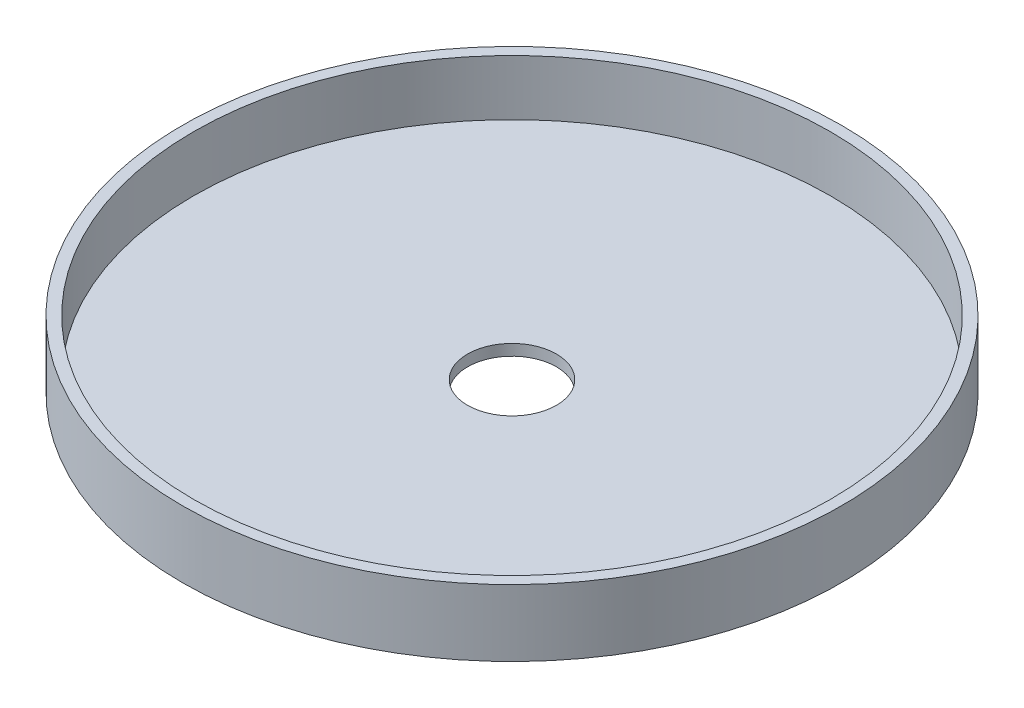
ISO-10303-21;
HEADER;
FILE_DESCRIPTION(('STEP AP214'),'2;1');
FILE_NAME('part.step','',(''),(''),'','','');
FILE_SCHEMA(('AUTOMOTIVE_DESIGN { 1 0 10303 214 1 1 1 1 }'));
ENDSEC;
DATA;
#1=APPLICATION_CONTEXT('core data for automotive mechanical design processes');
#2=APPLICATION_PROTOCOL_DEFINITION('international standard','automotive_design',2000,#1);
#3=PRODUCT_CONTEXT('',#1,'mechanical');
#4=PRODUCT('Part','Part','',(#3));
#5=PRODUCT_RELATED_PRODUCT_CATEGORY('part','',(#4));
#6=PRODUCT_DEFINITION_FORMATION('','',#4);
#7=PRODUCT_DEFINITION_CONTEXT('part definition',#1,'design');
#8=PRODUCT_DEFINITION('design','',#6,#7);
#9=PRODUCT_DEFINITION_SHAPE('','',#8);
#10=(LENGTH_UNIT() NAMED_UNIT(*) SI_UNIT(.MILLI.,.METRE.));
#11=(NAMED_UNIT(*) PLANE_ANGLE_UNIT() SI_UNIT($,.RADIAN.));
#12=(NAMED_UNIT(*) SI_UNIT($,.STERADIAN.) SOLID_ANGLE_UNIT());
#13=UNCERTAINTY_MEASURE_WITH_UNIT(LENGTH_MEASURE(1.E-05),#10,'distance_accuracy_value','');
#14=(GEOMETRIC_REPRESENTATION_CONTEXT(3) GLOBAL_UNCERTAINTY_ASSIGNED_CONTEXT((#13)) GLOBAL_UNIT_ASSIGNED_CONTEXT((#10,
#11,#12)) REPRESENTATION_CONTEXT('',''));
#15=CARTESIAN_POINT('',(0.,0.,0.));
#16=DIRECTION('',(0.,0.,1.));
#17=DIRECTION('',(1.,0.,0.));
#18=AXIS2_PLACEMENT_3D('',#15,#16,#17);
#19=CARTESIAN_POINT('',(0.,1.5,0.));
#20=DIRECTION('',(0.,-1.,0.));
#21=DIRECTION('',(0.,0.,-1.));
#22=AXIS2_PLACEMENT_3D('',#19,#20,#21);
#23=CYLINDRICAL_SURFACE('',#22,44.5);
#24=CARTESIAN_POINT('',(0.,0.,0.));
#25=DIRECTION('',(0.,1.,0.));
#26=DIRECTION('',(0.,0.,1.));
#27=AXIS2_PLACEMENT_3D('',#24,#25,#26);
#28=CIRCLE('',#27,44.5);
#29=CARTESIAN_POINT('',(0.,0.,44.5));
#30=VERTEX_POINT('',#29);
#31=EDGE_CURVE('E45',#30,#30,#28,.T.);
#32=ORIENTED_EDGE('',*,*,#31,.T.);
#33=EDGE_LOOP('',(#32));
#34=FACE_BOUND('',#33,.T.);
#35=CARTESIAN_POINT('',(0.,9.,0.));
#36=DIRECTION('',(0.,1.,0.));
#37=DIRECTION('',(0.,0.,1.));
#38=AXIS2_PLACEMENT_3D('',#35,#36,#37);
#39=CIRCLE('',#38,44.5);
#40=CARTESIAN_POINT('',(0.,9.,44.5));
#41=VERTEX_POINT('',#40);
#42=EDGE_CURVE('E50',#41,#41,#39,.T.);
#43=ORIENTED_EDGE('',*,*,#42,.F.);
#44=EDGE_LOOP('',(#43));
#45=FACE_BOUND('',#44,.T.);
#46=ADVANCED_FACE('F37',(#34,#45),#23,.T.);
#47=CARTESIAN_POINT('',(0.,0.,0.));
#48=DIRECTION('',(0.,1.,0.));
#49=DIRECTION('',(0.,0.,1.));
#50=AXIS2_PLACEMENT_3D('',#47,#48,#49);
#51=PLANE('',#50);
#52=CARTESIAN_POINT('',(0.,0.,0.));
#53=DIRECTION('',(0.,-1.,0.));
#54=DIRECTION('',(0.,0.,-1.));
#55=AXIS2_PLACEMENT_3D('',#52,#53,#54);
#56=CIRCLE('',#55,6.);
#57=CARTESIAN_POINT('',(0.,0.,-6.));
#58=VERTEX_POINT('',#57);
#59=EDGE_CURVE('E60',#58,#58,#56,.T.);
#60=ORIENTED_EDGE('',*,*,#59,.F.);
#61=EDGE_LOOP('',(#60));
#62=FACE_BOUND('',#61,.T.);
#63=ORIENTED_EDGE('',*,*,#31,.F.);
#64=EDGE_LOOP('',(#63));
#65=FACE_BOUND('',#64,.T.);
#66=ADVANCED_FACE('F86',(#62,#65),#51,.F.);
#67=CARTESIAN_POINT('',(0.,9.,0.));
#68=DIRECTION('',(0.,1.,0.));
#69=DIRECTION('',(0.,0.,1.));
#70=AXIS2_PLACEMENT_3D('',#67,#68,#69);
#71=PLANE('',#70);
#72=ORIENTED_EDGE('',*,*,#42,.T.);
#73=EDGE_LOOP('',(#72));
#74=FACE_BOUND('',#73,.T.);
#75=CARTESIAN_POINT('',(0.,9.,0.));
#76=DIRECTION('',(0.,1.,0.));
#77=DIRECTION('',(0.,0.,1.));
#78=AXIS2_PLACEMENT_3D('',#75,#76,#77);
#79=CIRCLE('',#78,43.);
#80=CARTESIAN_POINT('',(0.,9.,43.));
#81=VERTEX_POINT('',#80);
#82=EDGE_CURVE('E56',#81,#81,#79,.T.);
#83=ORIENTED_EDGE('',*,*,#82,.F.);
#84=EDGE_LOOP('',(#83));
#85=FACE_BOUND('',#84,.T.);
#86=ADVANCED_FACE('F81',(#74,#85),#71,.T.);
#87=CARTESIAN_POINT('',(0.,9.,0.));
#88=DIRECTION('',(0.,-1.,0.));
#89=DIRECTION('',(0.,0.,-1.));
#90=AXIS2_PLACEMENT_3D('',#87,#88,#89);
#91=CYLINDRICAL_SURFACE('',#90,43.);
#92=ORIENTED_EDGE('',*,*,#82,.T.);
#93=EDGE_LOOP('',(#92));
#94=FACE_BOUND('',#93,.T.);
#95=CARTESIAN_POINT('',(0.,1.5,0.));
#96=DIRECTION('',(0.,1.,0.));
#97=DIRECTION('',(0.,0.,1.));
#98=AXIS2_PLACEMENT_3D('',#95,#96,#97);
#99=CIRCLE('',#98,43.);
#100=CARTESIAN_POINT('',(0.,1.5,43.));
#101=VERTEX_POINT('',#100);
#102=EDGE_CURVE('E10',#101,#101,#99,.F.);
#103=ORIENTED_EDGE('',*,*,#102,.T.);
#104=EDGE_LOOP('',(#103));
#105=FACE_BOUND('',#104,.T.);
#106=ADVANCED_FACE('F74',(#94,#105),#91,.F.);
#107=CARTESIAN_POINT('',(0.,1.5,0.));
#108=DIRECTION('',(0.,1.,0.));
#109=DIRECTION('',(0.,0.,1.));
#110=AXIS2_PLACEMENT_3D('',#107,#108,#109);
#111=PLANE('',#110);
#112=CARTESIAN_POINT('',(0.,1.5,0.));
#113=DIRECTION('',(0.,1.,0.));
#114=DIRECTION('',(0.,0.,1.));
#115=AXIS2_PLACEMENT_3D('',#112,#113,#114);
#116=CIRCLE('',#115,6.);
#117=CARTESIAN_POINT('',(0.,1.5,6.));
#118=VERTEX_POINT('',#117);
#119=EDGE_CURVE('E40',#118,#118,#116,.T.);
#120=ORIENTED_EDGE('',*,*,#119,.F.);
#121=EDGE_LOOP('',(#120));
#122=FACE_BOUND('',#121,.T.);
#123=ORIENTED_EDGE('',*,*,#102,.F.);
#124=EDGE_LOOP('',(#123));
#125=FACE_BOUND('',#124,.T.);
#126=ADVANCED_FACE('F71',(#122,#125),#111,.T.);
#127=CARTESIAN_POINT('',(0.,9.,0.));
#128=DIRECTION('',(0.,-1.,0.));
#129=DIRECTION('',(0.,0.,-1.));
#130=AXIS2_PLACEMENT_3D('',#127,#128,#129);
#131=CYLINDRICAL_SURFACE('',#130,6.);
#132=ORIENTED_EDGE('',*,*,#119,.T.);
#133=EDGE_LOOP('',(#132));
#134=FACE_BOUND('',#133,.T.);
#135=ORIENTED_EDGE('',*,*,#59,.T.);
#136=EDGE_LOOP('',(#135));
#137=FACE_BOUND('',#136,.T.);
#138=ADVANCED_FACE('F69',(#134,#137),#131,.F.);
#139=CLOSED_SHELL('',(#46,#66,#86,#106,#126,#138));
#140=MANIFOLD_SOLID_BREP('B2',#139);
#141=ADVANCED_BREP_SHAPE_REPRESENTATION('',(#18,#140),#14);
#142=SHAPE_DEFINITION_REPRESENTATION(#9,#141);
ENDSEC;
END-ISO-10303-21;
